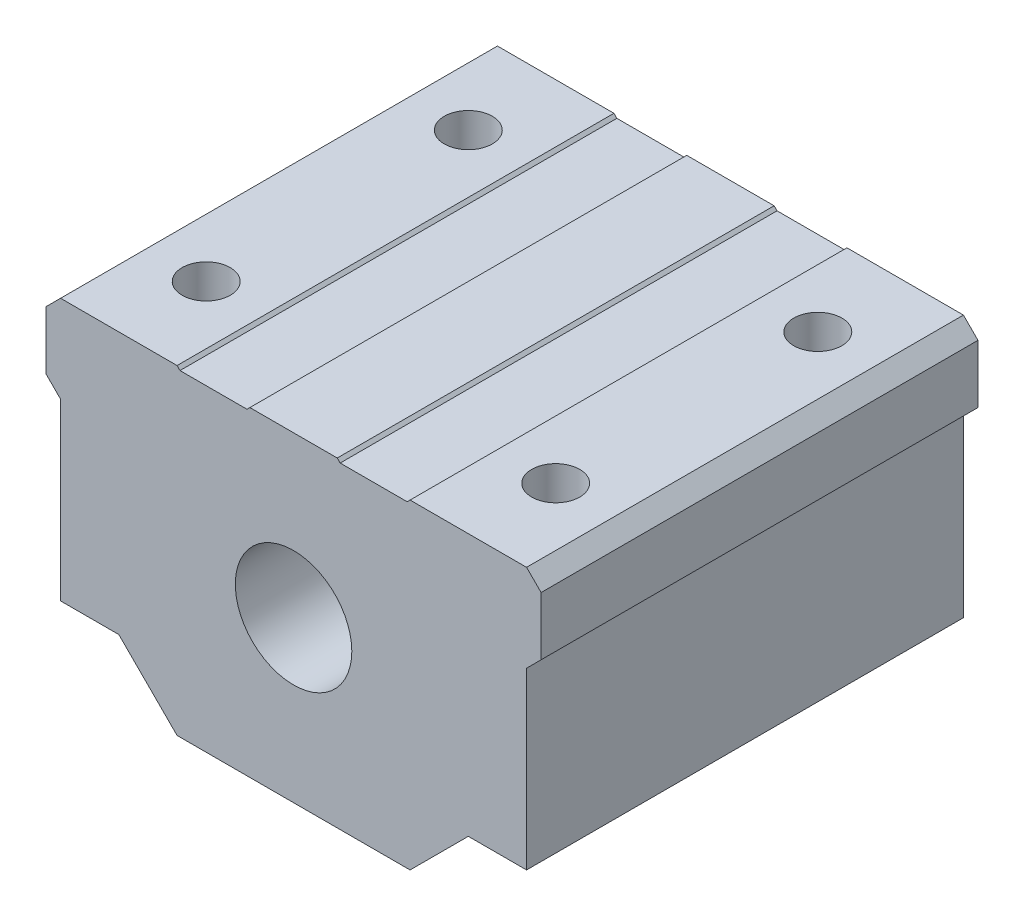
ISO-10303-21;
HEADER;
FILE_DESCRIPTION(('STEP AP214'),'2;1');
FILE_NAME('part.step','',(''),(''),'','','');
FILE_SCHEMA(('AUTOMOTIVE_DESIGN { 1 0 10303 214 1 1 1 1 }'));
ENDSEC;
DATA;
#1=APPLICATION_CONTEXT('core data for automotive mechanical design processes');
#2=APPLICATION_PROTOCOL_DEFINITION('international standard','automotive_design',2000,#1);
#3=PRODUCT_CONTEXT('',#1,'mechanical');
#4=PRODUCT('Part','Part','',(#3));
#5=PRODUCT_RELATED_PRODUCT_CATEGORY('part','',(#4));
#6=PRODUCT_DEFINITION_FORMATION('','',#4);
#7=PRODUCT_DEFINITION_CONTEXT('part definition',#1,'design');
#8=PRODUCT_DEFINITION('design','',#6,#7);
#9=PRODUCT_DEFINITION_SHAPE('','',#8);
#10=(LENGTH_UNIT() NAMED_UNIT(*) SI_UNIT(.MILLI.,.METRE.));
#11=(NAMED_UNIT(*) PLANE_ANGLE_UNIT() SI_UNIT($,.RADIAN.));
#12=(NAMED_UNIT(*) SI_UNIT($,.STERADIAN.) SOLID_ANGLE_UNIT());
#13=UNCERTAINTY_MEASURE_WITH_UNIT(LENGTH_MEASURE(1.E-05),#10,'distance_accuracy_value','');
#14=(GEOMETRIC_REPRESENTATION_CONTEXT(3) GLOBAL_UNCERTAINTY_ASSIGNED_CONTEXT((#13)) GLOBAL_UNIT_ASSIGNED_CONTEXT((#10,
#11,#12)) REPRESENTATION_CONTEXT('',''));
#15=CARTESIAN_POINT('',(0.,0.,0.));
#16=DIRECTION('',(0.,0.,1.));
#17=DIRECTION('',(1.,0.,0.));
#18=AXIS2_PLACEMENT_3D('',#15,#16,#17);
#19=CARTESIAN_POINT('',(-17.,22.,30.));
#20=DIRECTION('',(0.,-1.,0.));
#21=DIRECTION('',(0.,0.,-1.));
#22=AXIS2_PLACEMENT_3D('',#19,#20,#21);
#23=PLANE('',#22);
#24=DIRECTION('',(-1.,0.,0.));
#25=VECTOR('',#24,1.);
#26=CARTESIAN_POINT('',(-17.,22.,0.));
#27=LINE('',#26,#25);
#28=CARTESIAN_POINT('',(3.,22.,0.));
#29=VERTEX_POINT('',#28);
#30=CARTESIAN_POINT('',(-3.,22.,0.));
#31=VERTEX_POINT('',#30);
#32=EDGE_CURVE('E365',#29,#31,#27,.T.);
#33=ORIENTED_EDGE('',*,*,#32,.T.);
#34=DIRECTION('',(0.,0.,-1.));
#35=VECTOR('',#34,1.);
#36=CARTESIAN_POINT('',(-3.,22.,30.));
#37=LINE('',#36,#35);
#38=CARTESIAN_POINT('',(-3.,22.,30.));
#39=VERTEX_POINT('',#38);
#40=EDGE_CURVE('E240',#39,#31,#37,.T.);
#41=ORIENTED_EDGE('',*,*,#40,.F.);
#42=DIRECTION('',(-1.,0.,0.));
#43=VECTOR('',#42,1.);
#44=CARTESIAN_POINT('',(-17.,22.,30.));
#45=LINE('',#44,#43);
#46=CARTESIAN_POINT('',(3.,22.,30.));
#47=VERTEX_POINT('',#46);
#48=EDGE_CURVE('E337',#47,#39,#45,.T.);
#49=ORIENTED_EDGE('',*,*,#48,.F.);
#50=DIRECTION('',(0.,0.,-1.));
#51=VECTOR('',#50,1.);
#52=CARTESIAN_POINT('',(3.,22.,30.));
#53=LINE('',#52,#51);
#54=EDGE_CURVE('E262',#47,#29,#53,.T.);
#55=ORIENTED_EDGE('',*,*,#54,.T.);
#56=EDGE_LOOP('',(#33,#41,#49,#55));
#57=FACE_BOUND('',#56,.T.);
#58=ADVANCED_FACE('F34',(#57),#23,.F.);
#59=CARTESIAN_POINT('',(12.,22.,24.));
#60=DIRECTION('',(0.,1.,0.));
#61=DIRECTION('',(0.,0.,1.));
#62=AXIS2_PLACEMENT_3D('',#59,#60,#61);
#63=CIRCLE('',#62,1.64999999999999);
#64=CARTESIAN_POINT('',(12.,22.,25.65));
#65=VERTEX_POINT('',#64);
#66=EDGE_CURVE('E285',#65,#65,#63,.T.);
#67=ORIENTED_EDGE('',*,*,#66,.F.);
#68=EDGE_LOOP('',(#67));
#69=FACE_BOUND('',#68,.T.);
#70=CARTESIAN_POINT('',(12.,22.,6.));
#71=DIRECTION('',(0.,1.,0.));
#72=DIRECTION('',(0.,0.,1.));
#73=AXIS2_PLACEMENT_3D('',#70,#71,#72);
#74=CIRCLE('',#73,1.64999999999999);
#75=CARTESIAN_POINT('',(12.,22.,7.64999999999999));
#76=VERTEX_POINT('',#75);
#77=EDGE_CURVE('E271',#76,#76,#74,.T.);
#78=ORIENTED_EDGE('',*,*,#77,.F.);
#79=EDGE_LOOP('',(#78));
#80=FACE_BOUND('',#79,.T.);
#81=CARTESIAN_POINT('',(16.,22.,0.));
#82=VERTEX_POINT('',#81);
#83=CARTESIAN_POINT('',(8.,22.,0.));
#84=VERTEX_POINT('',#83);
#85=EDGE_CURVE('E361',#82,#84,#27,.T.);
#86=ORIENTED_EDGE('',*,*,#85,.T.);
#87=DIRECTION('',(0.,0.,-1.));
#88=VECTOR('',#87,1.);
#89=CARTESIAN_POINT('',(8.,22.,30.));
#90=LINE('',#89,#88);
#91=CARTESIAN_POINT('',(8.,22.,30.));
#92=VERTEX_POINT('',#91);
#93=EDGE_CURVE('E260',#92,#84,#90,.T.);
#94=ORIENTED_EDGE('',*,*,#93,.F.);
#95=CARTESIAN_POINT('',(16.,22.,30.));
#96=VERTEX_POINT('',#95);
#97=EDGE_CURVE('E333',#96,#92,#45,.T.);
#98=ORIENTED_EDGE('',*,*,#97,.F.);
#99=DIRECTION('',(0.,0.,-1.));
#100=VECTOR('',#99,1.);
#101=CARTESIAN_POINT('',(16.,22.,30.));
#102=LINE('',#101,#100);
#103=EDGE_CURVE('E426',#96,#82,#102,.T.);
#104=ORIENTED_EDGE('',*,*,#103,.T.);
#105=EDGE_LOOP('',(#86,#94,#98,#104));
#106=FACE_BOUND('',#105,.T.);
#107=ADVANCED_FACE('F460',(#69,#80,#106),#23,.F.);
#108=CARTESIAN_POINT('',(-8.,0.,30.));
#109=DIRECTION('',(0.707106781186549,0.707106781186546,0.));
#110=DIRECTION('',(-0.707106781186546,0.707106781186549,0.));
#111=AXIS2_PLACEMENT_3D('',#108,#109,#110);
#112=PLANE('',#111);
#113=DIRECTION('',(0.,0.,-1.));
#114=VECTOR('',#113,1.);
#115=CARTESIAN_POINT('',(-12.,3.99999999999999,30.));
#116=LINE('',#115,#114);
#117=CARTESIAN_POINT('',(-12.,3.99999999999999,30.));
#118=VERTEX_POINT('',#117);
#119=CARTESIAN_POINT('',(-12.,3.99999999999999,25.5));
#120=VERTEX_POINT('',#119);
#121=EDGE_CURVE('E372',#118,#120,#116,.T.);
#122=ORIENTED_EDGE('',*,*,#121,.T.);
#123=CARTESIAN_POINT('',(-12.,4.00000000000001,24.));
#124=DIRECTION('',(0.707106781186549,0.707106781186546,0.));
#125=DIRECTION('',(-0.707106781186546,0.707106781186549,0.));
#126=AXIS2_PLACEMENT_3D('',#123,#124,#125);
#127=ELLIPSE('',#126,2.12132034355965,1.5);
#128=CARTESIAN_POINT('',(-12.,3.99999999999999,22.5));
#129=VERTEX_POINT('',#128);
#130=EDGE_CURVE('E295',#120,#129,#127,.T.);
#131=ORIENTED_EDGE('',*,*,#130,.T.);
#132=CARTESIAN_POINT('',(-12.,3.99999999999999,7.5));
#133=VERTEX_POINT('',#132);
#134=EDGE_CURVE('E376',#129,#133,#116,.T.);
#135=ORIENTED_EDGE('',*,*,#134,.T.);
#136=CARTESIAN_POINT('',(-12.,4.00000000000001,6.));
#137=DIRECTION('',(0.707106781186549,0.707106781186546,0.));
#138=DIRECTION('',(-0.707106781186546,0.707106781186549,0.));
#139=AXIS2_PLACEMENT_3D('',#136,#137,#138);
#140=ELLIPSE('',#139,2.12132034355965,1.5);
#141=CARTESIAN_POINT('',(-12.,3.99999999999999,4.5));
#142=VERTEX_POINT('',#141);
#143=EDGE_CURVE('E292',#133,#142,#140,.T.);
#144=ORIENTED_EDGE('',*,*,#143,.T.);
#145=CARTESIAN_POINT('',(-12.,3.99999999999999,0.));
#146=VERTEX_POINT('',#145);
#147=EDGE_CURVE('E344',#142,#146,#116,.T.);
#148=ORIENTED_EDGE('',*,*,#147,.T.);
#149=DIRECTION('',(0.707106781186546,-0.707106781186549,0.));
#150=VECTOR('',#149,1.);
#151=CARTESIAN_POINT('',(-8.,0.,0.));
#152=LINE('',#151,#150);
#153=CARTESIAN_POINT('',(-8.,0.,0.));
#154=VERTEX_POINT('',#153);
#155=EDGE_CURVE('E314',#146,#154,#152,.T.);
#156=ORIENTED_EDGE('',*,*,#155,.T.);
#157=DIRECTION('',(0.,0.,-1.));
#158=VECTOR('',#157,1.);
#159=CARTESIAN_POINT('',(-8.,0.,30.));
#160=LINE('',#159,#158);
#161=CARTESIAN_POINT('',(-8.,0.,30.));
#162=VERTEX_POINT('',#161);
#163=EDGE_CURVE('E396',#162,#154,#160,.T.);
#164=ORIENTED_EDGE('',*,*,#163,.F.);
#165=DIRECTION('',(0.707106781186546,-0.707106781186549,0.));
#166=VECTOR('',#165,1.);
#167=CARTESIAN_POINT('',(-8.,0.,30.));
#168=LINE('',#167,#166);
#169=EDGE_CURVE('E317',#118,#162,#168,.T.);
#170=ORIENTED_EDGE('',*,*,#169,.F.);
#171=EDGE_LOOP('',(#122,#131,#135,#144,#148,#156,#164,#170));
#172=FACE_BOUND('',#171,.T.);
#173=ADVANCED_FACE('F467',(#172),#112,.F.);
#174=CARTESIAN_POINT('',(8.,0.,30.));
#175=DIRECTION('',(0.,1.,0.));
#176=DIRECTION('',(0.,0.,1.));
#177=AXIS2_PLACEMENT_3D('',#174,#175,#176);
#178=PLANE('',#177);
#179=DIRECTION('',(1.,0.,0.));
#180=VECTOR('',#179,1.);
#181=CARTESIAN_POINT('',(8.,0.,0.));
#182=LINE('',#181,#180);
#183=CARTESIAN_POINT('',(8.,0.,0.));
#184=VERTEX_POINT('',#183);
#185=EDGE_CURVE('E347',#154,#184,#182,.T.);
#186=ORIENTED_EDGE('',*,*,#185,.T.);
#187=DIRECTION('',(0.,0.,-1.));
#188=VECTOR('',#187,1.);
#189=CARTESIAN_POINT('',(8.,0.,30.));
#190=LINE('',#189,#188);
#191=CARTESIAN_POINT('',(8.,0.,30.));
#192=VERTEX_POINT('',#191);
#193=EDGE_CURVE('E392',#192,#184,#190,.T.);
#194=ORIENTED_EDGE('',*,*,#193,.F.);
#195=DIRECTION('',(1.,0.,0.));
#196=VECTOR('',#195,1.);
#197=CARTESIAN_POINT('',(8.,0.,30.));
#198=LINE('',#197,#196);
#199=EDGE_CURVE('E320',#162,#192,#198,.T.);
#200=ORIENTED_EDGE('',*,*,#199,.F.);
#201=ORIENTED_EDGE('',*,*,#163,.T.);
#202=EDGE_LOOP('',(#186,#194,#200,#201));
#203=FACE_BOUND('',#202,.T.);
#204=ADVANCED_FACE('F528',(#203),#178,.F.);
#205=CARTESIAN_POINT('',(8.,0.,30.));
#206=DIRECTION('',(-0.707106781186549,0.707106781186546,0.));
#207=DIRECTION('',(-0.707106781186546,-0.707106781186549,0.));
#208=AXIS2_PLACEMENT_3D('',#205,#206,#207);
#209=PLANE('',#208);
#210=DIRECTION('',(0.,0.,-1.));
#211=VECTOR('',#210,1.);
#212=CARTESIAN_POINT('',(12.,3.99999999999999,30.));
#213=LINE('',#212,#211);
#214=CARTESIAN_POINT('',(12.,3.99999999999999,4.5));
#215=VERTEX_POINT('',#214);
#216=CARTESIAN_POINT('',(12.,3.99999999999999,0.));
#217=VERTEX_POINT('',#216);
#218=EDGE_CURVE('E388',#215,#217,#213,.T.);
#219=ORIENTED_EDGE('',*,*,#218,.F.);
#220=CARTESIAN_POINT('',(12.,4.00000000000001,6.));
#221=DIRECTION('',(-0.707106781186549,0.707106781186546,0.));
#222=DIRECTION('',(0.707106781186546,0.707106781186549,0.));
#223=AXIS2_PLACEMENT_3D('',#220,#221,#222);
#224=ELLIPSE('',#223,2.12132034355965,1.5);
#225=CARTESIAN_POINT('',(12.,3.99999999999999,7.5));
#226=VERTEX_POINT('',#225);
#227=EDGE_CURVE('E307',#215,#226,#224,.T.);
#228=ORIENTED_EDGE('',*,*,#227,.T.);
#229=CARTESIAN_POINT('',(12.,3.99999999999999,22.5));
#230=VERTEX_POINT('',#229);
#231=EDGE_CURVE('E393',#230,#226,#213,.T.);
#232=ORIENTED_EDGE('',*,*,#231,.F.);
#233=CARTESIAN_POINT('',(12.,4.00000000000001,24.));
#234=DIRECTION('',(-0.707106781186549,0.707106781186546,0.));
#235=DIRECTION('',(0.707106781186546,0.707106781186549,0.));
#236=AXIS2_PLACEMENT_3D('',#233,#234,#235);
#237=ELLIPSE('',#236,2.12132034355965,1.5);
#238=CARTESIAN_POINT('',(12.,3.99999999999999,25.5));
#239=VERTEX_POINT('',#238);
#240=EDGE_CURVE('E301',#230,#239,#237,.T.);
#241=ORIENTED_EDGE('',*,*,#240,.T.);
#242=CARTESIAN_POINT('',(12.,3.99999999999999,30.));
#243=VERTEX_POINT('',#242);
#244=EDGE_CURVE('E389',#243,#239,#213,.T.);
#245=ORIENTED_EDGE('',*,*,#244,.F.);
#246=DIRECTION('',(0.707106781186546,0.707106781186549,0.));
#247=VECTOR('',#246,1.);
#248=CARTESIAN_POINT('',(8.,0.,30.));
#249=LINE('',#248,#247);
#250=EDGE_CURVE('E323',#192,#243,#249,.T.);
#251=ORIENTED_EDGE('',*,*,#250,.F.);
#252=ORIENTED_EDGE('',*,*,#193,.T.);
#253=DIRECTION('',(0.707106781186546,0.707106781186549,0.));
#254=VECTOR('',#253,1.);
#255=CARTESIAN_POINT('',(8.,0.,0.));
#256=LINE('',#255,#254);
#257=EDGE_CURVE('E349',#184,#217,#256,.T.);
#258=ORIENTED_EDGE('',*,*,#257,.T.);
#259=EDGE_LOOP('',(#219,#228,#232,#241,#245,#251,#252,#258));
#260=FACE_BOUND('',#259,.T.);
#261=ADVANCED_FACE('F534',(#260),#209,.F.);
#262=CARTESIAN_POINT('',(12.,3.99999999999999,30.));
#263=DIRECTION('',(0.,1.,0.));
#264=DIRECTION('',(0.,0.,1.));
#265=AXIS2_PLACEMENT_3D('',#262,#263,#264);
#266=PLANE('',#265);
#267=ORIENTED_EDGE('',*,*,#231,.T.);
#268=CARTESIAN_POINT('',(12.,3.99999999999999,6.));
#269=DIRECTION('',(0.,1.,0.));
#270=DIRECTION('',(0.,0.,1.));
#271=AXIS2_PLACEMENT_3D('',#268,#269,#270);
#272=CIRCLE('',#271,1.5);
#273=EDGE_CURVE('E304',#226,#215,#272,.T.);
#274=ORIENTED_EDGE('',*,*,#273,.T.);
#275=ORIENTED_EDGE('',*,*,#218,.T.);
#276=DIRECTION('',(1.,0.,0.));
#277=VECTOR('',#276,1.);
#278=CARTESIAN_POINT('',(12.,3.99999999999999,0.));
#279=LINE('',#278,#277);
#280=CARTESIAN_POINT('',(16.,3.99999999999999,0.));
#281=VERTEX_POINT('',#280);
#282=EDGE_CURVE('E352',#217,#281,#279,.T.);
#283=ORIENTED_EDGE('',*,*,#282,.T.);
#284=DIRECTION('',(0.,0.,-1.));
#285=VECTOR('',#284,1.);
#286=CARTESIAN_POINT('',(16.,3.99999999999999,30.));
#287=LINE('',#286,#285);
#288=CARTESIAN_POINT('',(16.,3.99999999999999,30.));
#289=VERTEX_POINT('',#288);
#290=EDGE_CURVE('E385',#289,#281,#287,.T.);
#291=ORIENTED_EDGE('',*,*,#290,.F.);
#292=DIRECTION('',(1.,0.,0.));
#293=VECTOR('',#292,1.);
#294=CARTESIAN_POINT('',(12.,3.99999999999999,30.));
#295=LINE('',#294,#293);
#296=EDGE_CURVE('E325',#243,#289,#295,.T.);
#297=ORIENTED_EDGE('',*,*,#296,.F.);
#298=ORIENTED_EDGE('',*,*,#244,.T.);
#299=CARTESIAN_POINT('',(12.,3.99999999999999,24.));
#300=DIRECTION('',(0.,1.,0.));
#301=DIRECTION('',(0.,0.,1.));
#302=AXIS2_PLACEMENT_3D('',#299,#300,#301);
#303=CIRCLE('',#302,1.5);
#304=EDGE_CURVE('E298',#239,#230,#303,.T.);
#305=ORIENTED_EDGE('',*,*,#304,.T.);
#306=EDGE_LOOP('',(#267,#274,#275,#283,#291,#297,#298,#305));
#307=FACE_BOUND('',#306,.T.);
#308=ADVANCED_FACE('F541',(#307),#266,.F.);
#309=CARTESIAN_POINT('',(16.,3.99999999999999,30.));
#310=DIRECTION('',(-1.,0.,0.));
#311=DIRECTION('',(0.,0.,1.));
#312=AXIS2_PLACEMENT_3D('',#309,#310,#311);
#313=PLANE('',#312);
#314=DIRECTION('',(0.,1.,0.));
#315=VECTOR('',#314,1.);
#316=CARTESIAN_POINT('',(16.,3.99999999999999,0.));
#317=LINE('',#316,#315);
#318=CARTESIAN_POINT('',(16.,16.,0.));
#319=VERTEX_POINT('',#318);
#320=EDGE_CURVE('E354',#281,#319,#317,.T.);
#321=ORIENTED_EDGE('',*,*,#320,.T.);
#322=DIRECTION('',(0.,0.,-1.));
#323=VECTOR('',#322,1.);
#324=CARTESIAN_POINT('',(16.,16.,30.));
#325=LINE('',#324,#323);
#326=CARTESIAN_POINT('',(16.,16.,30.));
#327=VERTEX_POINT('',#326);
#328=EDGE_CURVE('E382',#327,#319,#325,.T.);
#329=ORIENTED_EDGE('',*,*,#328,.F.);
#330=DIRECTION('',(0.,1.,0.));
#331=VECTOR('',#330,1.);
#332=CARTESIAN_POINT('',(16.,3.99999999999999,30.));
#333=LINE('',#332,#331);
#334=EDGE_CURVE('E327',#289,#327,#333,.T.);
#335=ORIENTED_EDGE('',*,*,#334,.F.);
#336=ORIENTED_EDGE('',*,*,#290,.T.);
#337=EDGE_LOOP('',(#321,#329,#335,#336));
#338=FACE_BOUND('',#337,.T.);
#339=ADVANCED_FACE('F482',(#338),#313,.F.);
#340=CARTESIAN_POINT('',(17.,16.,30.));
#341=DIRECTION('',(-1.,0.,0.));
#342=DIRECTION('',(0.,0.,1.));
#343=AXIS2_PLACEMENT_3D('',#340,#341,#342);
#344=PLANE('',#343);
#345=DIRECTION('',(0.,1.,0.));
#346=VECTOR('',#345,1.);
#347=CARTESIAN_POINT('',(17.,16.,30.));
#348=LINE('',#347,#346);
#349=CARTESIAN_POINT('',(17.,17.,30.));
#350=VERTEX_POINT('',#349);
#351=CARTESIAN_POINT('',(17.,21.,30.));
#352=VERTEX_POINT('',#351);
#353=EDGE_CURVE('E329',#350,#352,#348,.T.);
#354=ORIENTED_EDGE('',*,*,#353,.F.);
#355=DIRECTION('',(0.,0.,-1.));
#356=VECTOR('',#355,1.);
#357=CARTESIAN_POINT('',(17.,17.,30.));
#358=LINE('',#357,#356);
#359=CARTESIAN_POINT('',(17.,17.,0.));
#360=VERTEX_POINT('',#359);
#361=EDGE_CURVE('E423',#350,#360,#358,.T.);
#362=ORIENTED_EDGE('',*,*,#361,.T.);
#363=DIRECTION('',(0.,1.,0.));
#364=VECTOR('',#363,1.);
#365=CARTESIAN_POINT('',(17.,16.,0.));
#366=LINE('',#365,#364);
#367=CARTESIAN_POINT('',(17.,21.,0.));
#368=VERTEX_POINT('',#367);
#369=EDGE_CURVE('E357',#360,#368,#366,.T.);
#370=ORIENTED_EDGE('',*,*,#369,.T.);
#371=DIRECTION('',(0.,0.,1.));
#372=VECTOR('',#371,1.);
#373=CARTESIAN_POINT('',(17.,21.,30.));
#374=LINE('',#373,#372);
#375=EDGE_CURVE('E421',#368,#352,#374,.T.);
#376=ORIENTED_EDGE('',*,*,#375,.T.);
#377=EDGE_LOOP('',(#354,#362,#370,#376));
#378=FACE_BOUND('',#377,.T.);
#379=ADVANCED_FACE('F474',(#378),#344,.F.);
#380=CARTESIAN_POINT('',(-12.,22.,6.));
#381=DIRECTION('',(0.,1.,0.));
#382=DIRECTION('',(0.,0.,1.));
#383=AXIS2_PLACEMENT_3D('',#380,#381,#382);
#384=CIRCLE('',#383,1.64999999999999);
#385=CARTESIAN_POINT('',(-12.,22.,7.64999999999999));
#386=VERTEX_POINT('',#385);
#387=EDGE_CURVE('E239',#386,#386,#384,.T.);
#388=ORIENTED_EDGE('',*,*,#387,.F.);
#389=EDGE_LOOP('',(#388));
#390=FACE_BOUND('',#389,.T.);
#391=CARTESIAN_POINT('',(-12.,22.,24.));
#392=DIRECTION('',(0.,1.,0.));
#393=DIRECTION('',(0.,0.,1.));
#394=AXIS2_PLACEMENT_3D('',#391,#392,#393);
#395=CIRCLE('',#394,1.64999999999999);
#396=CARTESIAN_POINT('',(-12.,22.,25.65));
#397=VERTEX_POINT('',#396);
#398=EDGE_CURVE('E278',#397,#397,#395,.T.);
#399=ORIENTED_EDGE('',*,*,#398,.F.);
#400=EDGE_LOOP('',(#399));
#401=FACE_BOUND('',#400,.T.);
#402=CARTESIAN_POINT('',(-8.,22.,30.));
#403=VERTEX_POINT('',#402);
#404=CARTESIAN_POINT('',(-16.,22.,30.));
#405=VERTEX_POINT('',#404);
#406=EDGE_CURVE('E332',#403,#405,#45,.T.);
#407=ORIENTED_EDGE('',*,*,#406,.F.);
#408=DIRECTION('',(0.,0.,-1.));
#409=VECTOR('',#408,1.);
#410=CARTESIAN_POINT('',(-8.,22.,30.));
#411=LINE('',#410,#409);
#412=CARTESIAN_POINT('',(-8.,22.,0.));
#413=VERTEX_POINT('',#412);
#414=EDGE_CURVE('E214',#403,#413,#411,.T.);
#415=ORIENTED_EDGE('',*,*,#414,.T.);
#416=CARTESIAN_POINT('',(-16.,22.,0.));
#417=VERTEX_POINT('',#416);
#418=EDGE_CURVE('E360',#413,#417,#27,.T.);
#419=ORIENTED_EDGE('',*,*,#418,.T.);
#420=DIRECTION('',(0.,0.,1.));
#421=VECTOR('',#420,1.);
#422=CARTESIAN_POINT('',(-16.,22.,30.));
#423=LINE('',#422,#421);
#424=EDGE_CURVE('E429',#417,#405,#423,.T.);
#425=ORIENTED_EDGE('',*,*,#424,.T.);
#426=EDGE_LOOP('',(#407,#415,#419,#425));
#427=FACE_BOUND('',#426,.T.);
#428=ADVANCED_FACE('F463',(#390,#401,#427),#23,.F.);
#429=CARTESIAN_POINT('',(-17.,16.,30.));
#430=DIRECTION('',(1.,0.,0.));
#431=DIRECTION('',(0.,0.,-1.));
#432=AXIS2_PLACEMENT_3D('',#429,#430,#431);
#433=PLANE('',#432);
#434=DIRECTION('',(0.,-1.,0.));
#435=VECTOR('',#434,1.);
#436=CARTESIAN_POINT('',(-17.,16.,0.));
#437=LINE('',#436,#435);
#438=CARTESIAN_POINT('',(-17.,21.,0.));
#439=VERTEX_POINT('',#438);
#440=CARTESIAN_POINT('',(-17.,17.,0.));
#441=VERTEX_POINT('',#440);
#442=EDGE_CURVE('E364',#439,#441,#437,.T.);
#443=ORIENTED_EDGE('',*,*,#442,.T.);
#444=DIRECTION('',(0.,0.,1.));
#445=VECTOR('',#444,1.);
#446=CARTESIAN_POINT('',(-17.,17.,30.));
#447=LINE('',#446,#445);
#448=CARTESIAN_POINT('',(-17.,17.,30.));
#449=VERTEX_POINT('',#448);
#450=EDGE_CURVE('E411',#441,#449,#447,.T.);
#451=ORIENTED_EDGE('',*,*,#450,.T.);
#452=DIRECTION('',(0.,-1.,0.));
#453=VECTOR('',#452,1.);
#454=CARTESIAN_POINT('',(-17.,16.,30.));
#455=LINE('',#454,#453);
#456=CARTESIAN_POINT('',(-17.,21.,30.));
#457=VERTEX_POINT('',#456);
#458=EDGE_CURVE('E336',#457,#449,#455,.T.);
#459=ORIENTED_EDGE('',*,*,#458,.F.);
#460=DIRECTION('',(0.,0.,-1.));
#461=VECTOR('',#460,1.);
#462=CARTESIAN_POINT('',(-17.,21.,30.));
#463=LINE('',#462,#461);
#464=EDGE_CURVE('E408',#457,#439,#463,.T.);
#465=ORIENTED_EDGE('',*,*,#464,.T.);
#466=EDGE_LOOP('',(#443,#451,#459,#465));
#467=FACE_BOUND('',#466,.T.);
#468=ADVANCED_FACE('F473',(#467),#433,.F.);
#469=CARTESIAN_POINT('',(-16.,3.99999999999999,30.));
#470=DIRECTION('',(1.,0.,0.));
#471=DIRECTION('',(0.,0.,-1.));
#472=AXIS2_PLACEMENT_3D('',#469,#470,#471);
#473=PLANE('',#472);
#474=DIRECTION('',(0.,-1.,0.));
#475=VECTOR('',#474,1.);
#476=CARTESIAN_POINT('',(-16.,3.99999999999999,0.));
#477=LINE('',#476,#475);
#478=CARTESIAN_POINT('',(-16.,16.,0.));
#479=VERTEX_POINT('',#478);
#480=CARTESIAN_POINT('',(-16.,3.99999999999999,0.));
#481=VERTEX_POINT('',#480);
#482=EDGE_CURVE('E368',#479,#481,#477,.T.);
#483=ORIENTED_EDGE('',*,*,#482,.T.);
#484=DIRECTION('',(0.,0.,-1.));
#485=VECTOR('',#484,1.);
#486=CARTESIAN_POINT('',(-16.,3.99999999999999,30.));
#487=LINE('',#486,#485);
#488=CARTESIAN_POINT('',(-16.,3.99999999999999,30.));
#489=VERTEX_POINT('',#488);
#490=EDGE_CURVE('E375',#489,#481,#487,.T.);
#491=ORIENTED_EDGE('',*,*,#490,.F.);
#492=DIRECTION('',(0.,-1.,0.));
#493=VECTOR('',#492,1.);
#494=CARTESIAN_POINT('',(-16.,3.99999999999999,30.));
#495=LINE('',#494,#493);
#496=CARTESIAN_POINT('',(-16.,16.,30.));
#497=VERTEX_POINT('',#496);
#498=EDGE_CURVE('E340',#497,#489,#495,.T.);
#499=ORIENTED_EDGE('',*,*,#498,.F.);
#500=DIRECTION('',(0.,0.,-1.));
#501=VECTOR('',#500,1.);
#502=CARTESIAN_POINT('',(-16.,16.,30.));
#503=LINE('',#502,#501);
#504=EDGE_CURVE('E379',#497,#479,#503,.T.);
#505=ORIENTED_EDGE('',*,*,#504,.T.);
#506=EDGE_LOOP('',(#483,#491,#499,#505));
#507=FACE_BOUND('',#506,.T.);
#508=ADVANCED_FACE('F480',(#507),#473,.F.);
#509=CARTESIAN_POINT('',(-12.,3.99999999999999,30.));
#510=DIRECTION('',(0.,1.,0.));
#511=DIRECTION('',(0.,0.,1.));
#512=AXIS2_PLACEMENT_3D('',#509,#510,#511);
#513=PLANE('',#512);
#514=ORIENTED_EDGE('',*,*,#134,.F.);
#515=CARTESIAN_POINT('',(-12.,3.99999999999999,24.));
#516=DIRECTION('',(0.,1.,0.));
#517=DIRECTION('',(0.,0.,1.));
#518=AXIS2_PLACEMENT_3D('',#515,#516,#517);
#519=CIRCLE('',#518,1.5);
#520=EDGE_CURVE('E11',#129,#120,#519,.T.);
#521=ORIENTED_EDGE('',*,*,#520,.T.);
#522=ORIENTED_EDGE('',*,*,#121,.F.);
#523=DIRECTION('',(1.,0.,0.));
#524=VECTOR('',#523,1.);
#525=CARTESIAN_POINT('',(-12.,3.99999999999999,30.));
#526=LINE('',#525,#524);
#527=EDGE_CURVE('E342',#489,#118,#526,.T.);
#528=ORIENTED_EDGE('',*,*,#527,.F.);
#529=ORIENTED_EDGE('',*,*,#490,.T.);
#530=DIRECTION('',(1.,0.,0.));
#531=VECTOR('',#530,1.);
#532=CARTESIAN_POINT('',(-12.,3.99999999999999,0.));
#533=LINE('',#532,#531);
#534=EDGE_CURVE('E321',#481,#146,#533,.T.);
#535=ORIENTED_EDGE('',*,*,#534,.T.);
#536=ORIENTED_EDGE('',*,*,#147,.F.);
#537=CARTESIAN_POINT('',(-12.,3.99999999999999,6.));
#538=DIRECTION('',(0.,1.,0.));
#539=DIRECTION('',(0.,0.,1.));
#540=AXIS2_PLACEMENT_3D('',#537,#538,#539);
#541=CIRCLE('',#540,1.5);
#542=EDGE_CURVE('E43',#142,#133,#541,.T.);
#543=ORIENTED_EDGE('',*,*,#542,.T.);
#544=EDGE_LOOP('',(#514,#521,#522,#528,#529,#535,#536,#543));
#545=FACE_BOUND('',#544,.T.);
#546=ADVANCED_FACE('F521',(#545),#513,.F.);
#547=CARTESIAN_POINT('',(0.,0.,30.));
#548=DIRECTION('',(0.,0.,-1.));
#549=DIRECTION('',(-1.,0.,0.));
#550=AXIS2_PLACEMENT_3D('',#547,#548,#549);
#551=PLANE('',#550);
#552=CARTESIAN_POINT('',(0.,11.,30.));
#553=DIRECTION('',(0.,0.,1.));
#554=DIRECTION('',(1.,0.,0.));
#555=AXIS2_PLACEMENT_3D('',#552,#553,#554);
#556=CIRCLE('',#555,4.);
#557=CARTESIAN_POINT('',(4.,11.,30.));
#558=VERTEX_POINT('',#557);
#559=EDGE_CURVE('E310',#558,#558,#556,.T.);
#560=ORIENTED_EDGE('',*,*,#559,.F.);
#561=EDGE_LOOP('',(#560));
#562=FACE_BOUND('',#561,.T.);
#563=ORIENTED_EDGE('',*,*,#48,.T.);
#564=DIRECTION('',(-0.707106781186546,-0.707106781186549,0.));
#565=VECTOR('',#564,1.);
#566=CARTESIAN_POINT('',(-12.5,12.4999999999999,30.));
#567=LINE('',#566,#565);
#568=CARTESIAN_POINT('',(-3.2,21.8,30.));
#569=VERTEX_POINT('',#568);
#570=EDGE_CURVE('E215',#39,#569,#567,.T.);
#571=ORIENTED_EDGE('',*,*,#570,.T.);
#572=DIRECTION('',(1.,0.,0.));
#573=VECTOR('',#572,1.);
#574=CARTESIAN_POINT('',(0.,21.8,30.));
#575=LINE('',#574,#573);
#576=CARTESIAN_POINT('',(-7.8,21.8,30.));
#577=VERTEX_POINT('',#576);
#578=EDGE_CURVE('E210',#577,#569,#575,.T.);
#579=ORIENTED_EDGE('',*,*,#578,.F.);
#580=DIRECTION('',(-0.707106781186548,0.707106781186548,0.));
#581=VECTOR('',#580,1.);
#582=CARTESIAN_POINT('',(7.,7.,30.));
#583=LINE('',#582,#581);
#584=EDGE_CURVE('E218',#577,#403,#583,.T.);
#585=ORIENTED_EDGE('',*,*,#584,.T.);
#586=ORIENTED_EDGE('',*,*,#406,.T.);
#587=DIRECTION('',(0.707106781186548,0.707106781186548,0.));
#588=VECTOR('',#587,1.);
#589=CARTESIAN_POINT('',(-17.,21.,30.));
#590=LINE('',#589,#588);
#591=EDGE_CURVE('E415',#405,#457,#590,.F.);
#592=ORIENTED_EDGE('',*,*,#591,.T.);
#593=ORIENTED_EDGE('',*,*,#458,.T.);
#594=DIRECTION('',(-0.707106781186548,0.707106781186548,0.));
#595=VECTOR('',#594,1.);
#596=CARTESIAN_POINT('',(-16.,16.,30.));
#597=LINE('',#596,#595);
#598=EDGE_CURVE('E419',#449,#497,#597,.F.);
#599=ORIENTED_EDGE('',*,*,#598,.T.);
#600=ORIENTED_EDGE('',*,*,#498,.T.);
#601=ORIENTED_EDGE('',*,*,#527,.T.);
#602=ORIENTED_EDGE('',*,*,#169,.T.);
#603=ORIENTED_EDGE('',*,*,#199,.T.);
#604=ORIENTED_EDGE('',*,*,#250,.T.);
#605=ORIENTED_EDGE('',*,*,#296,.T.);
#606=ORIENTED_EDGE('',*,*,#334,.T.);
#607=DIRECTION('',(-0.707106781186548,-0.707106781186548,0.));
#608=VECTOR('',#607,1.);
#609=CARTESIAN_POINT('',(17.,17.,30.));
#610=LINE('',#609,#608);
#611=EDGE_CURVE('E417',#327,#350,#610,.F.);
#612=ORIENTED_EDGE('',*,*,#611,.T.);
#613=ORIENTED_EDGE('',*,*,#353,.T.);
#614=DIRECTION('',(0.707106781186548,-0.707106781186548,0.));
#615=VECTOR('',#614,1.);
#616=CARTESIAN_POINT('',(16.,22.,30.));
#617=LINE('',#616,#615);
#618=EDGE_CURVE('E413',#352,#96,#617,.F.);
#619=ORIENTED_EDGE('',*,*,#618,.T.);
#620=ORIENTED_EDGE('',*,*,#97,.T.);
#621=DIRECTION('',(-0.707106781186548,-0.707106781186548,0.));
#622=VECTOR('',#621,1.);
#623=CARTESIAN_POINT('',(-6.99999999999999,6.99999999999999,30.));
#624=LINE('',#623,#622);
#625=CARTESIAN_POINT('',(7.8,21.8,30.));
#626=VERTEX_POINT('',#625);
#627=EDGE_CURVE('E250',#92,#626,#624,.T.);
#628=ORIENTED_EDGE('',*,*,#627,.T.);
#629=DIRECTION('',(-1.,0.,0.));
#630=VECTOR('',#629,1.);
#631=CARTESIAN_POINT('',(0.,21.8,30.));
#632=LINE('',#631,#630);
#633=CARTESIAN_POINT('',(3.2,21.8,30.));
#634=VERTEX_POINT('',#633);
#635=EDGE_CURVE('E243',#626,#634,#632,.T.);
#636=ORIENTED_EDGE('',*,*,#635,.T.);
#637=DIRECTION('',(-0.707106781186546,0.707106781186549,0.));
#638=VECTOR('',#637,1.);
#639=CARTESIAN_POINT('',(12.5,12.4999999999999,30.));
#640=LINE('',#639,#638);
#641=EDGE_CURVE('E246',#634,#47,#640,.T.);
#642=ORIENTED_EDGE('',*,*,#641,.T.);
#643=EDGE_LOOP('',(#563,#571,#579,#585,#586,#592,#593,#599,#600,#601,#602,#603,#604,#605,#606,
#612,#613,#619,#620,#628,#636,#642));
#644=FACE_BOUND('',#643,.T.);
#645=ADVANCED_FACE('F226',(#562,#644),#551,.F.);
#646=CARTESIAN_POINT('',(0.,0.,0.));
#647=DIRECTION('',(0.,0.,-1.));
#648=DIRECTION('',(-1.,0.,0.));
#649=AXIS2_PLACEMENT_3D('',#646,#647,#648);
#650=PLANE('',#649);
#651=DIRECTION('',(-0.707106781186546,-0.707106781186549,0.));
#652=VECTOR('',#651,1.);
#653=CARTESIAN_POINT('',(-12.5,12.4999999999999,0.));
#654=LINE('',#653,#652);
#655=CARTESIAN_POINT('',(-3.2,21.8,0.));
#656=VERTEX_POINT('',#655);
#657=EDGE_CURVE('E227',#31,#656,#654,.T.);
#658=ORIENTED_EDGE('',*,*,#657,.F.);
#659=ORIENTED_EDGE('',*,*,#32,.F.);
#660=DIRECTION('',(-0.707106781186546,0.707106781186549,0.));
#661=VECTOR('',#660,1.);
#662=CARTESIAN_POINT('',(12.5,12.4999999999999,0.));
#663=LINE('',#662,#661);
#664=CARTESIAN_POINT('',(3.2,21.8,0.));
#665=VERTEX_POINT('',#664);
#666=EDGE_CURVE('E255',#665,#29,#663,.T.);
#667=ORIENTED_EDGE('',*,*,#666,.F.);
#668=DIRECTION('',(-1.,0.,0.));
#669=VECTOR('',#668,1.);
#670=CARTESIAN_POINT('',(0.,21.8,0.));
#671=LINE('',#670,#669);
#672=CARTESIAN_POINT('',(7.8,21.8,0.));
#673=VERTEX_POINT('',#672);
#674=EDGE_CURVE('E59',#673,#665,#671,.T.);
#675=ORIENTED_EDGE('',*,*,#674,.F.);
#676=DIRECTION('',(-0.707106781186548,-0.707106781186548,0.));
#677=VECTOR('',#676,1.);
#678=CARTESIAN_POINT('',(-6.99999999999999,6.99999999999999,0.));
#679=LINE('',#678,#677);
#680=EDGE_CURVE('E247',#84,#673,#679,.T.);
#681=ORIENTED_EDGE('',*,*,#680,.F.);
#682=ORIENTED_EDGE('',*,*,#85,.F.);
#683=DIRECTION('',(-0.707106781186548,0.707106781186548,0.));
#684=VECTOR('',#683,1.);
#685=CARTESIAN_POINT('',(19.,19.,0.));
#686=LINE('',#685,#684);
#687=EDGE_CURVE('E399',#82,#368,#686,.F.);
#688=ORIENTED_EDGE('',*,*,#687,.T.);
#689=ORIENTED_EDGE('',*,*,#369,.F.);
#690=DIRECTION('',(0.707106781186548,0.707106781186548,0.));
#691=VECTOR('',#690,1.);
#692=CARTESIAN_POINT('',(0.,0.,0.));
#693=LINE('',#692,#691);
#694=EDGE_CURVE('E404',#360,#319,#693,.F.);
#695=ORIENTED_EDGE('',*,*,#694,.T.);
#696=ORIENTED_EDGE('',*,*,#320,.F.);
#697=ORIENTED_EDGE('',*,*,#282,.F.);
#698=ORIENTED_EDGE('',*,*,#257,.F.);
#699=ORIENTED_EDGE('',*,*,#185,.F.);
#700=ORIENTED_EDGE('',*,*,#155,.F.);
#701=ORIENTED_EDGE('',*,*,#534,.F.);
#702=ORIENTED_EDGE('',*,*,#482,.F.);
#703=DIRECTION('',(0.707106781186548,-0.707106781186548,0.));
#704=VECTOR('',#703,1.);
#705=CARTESIAN_POINT('',(0.,0.,0.));
#706=LINE('',#705,#704);
#707=EDGE_CURVE('E406',#479,#441,#706,.F.);
#708=ORIENTED_EDGE('',*,*,#707,.T.);
#709=ORIENTED_EDGE('',*,*,#442,.F.);
#710=DIRECTION('',(-0.707106781186548,-0.707106781186548,0.));
#711=VECTOR('',#710,1.);
#712=CARTESIAN_POINT('',(-19.,19.,0.));
#713=LINE('',#712,#711);
#714=EDGE_CURVE('E401',#439,#417,#713,.F.);
#715=ORIENTED_EDGE('',*,*,#714,.T.);
#716=ORIENTED_EDGE('',*,*,#418,.F.);
#717=DIRECTION('',(-0.707106781186548,0.707106781186548,0.));
#718=VECTOR('',#717,1.);
#719=CARTESIAN_POINT('',(7.,7.,0.));
#720=LINE('',#719,#718);
#721=CARTESIAN_POINT('',(-7.8,21.8,0.));
#722=VERTEX_POINT('',#721);
#723=EDGE_CURVE('E230',#722,#413,#720,.T.);
#724=ORIENTED_EDGE('',*,*,#723,.F.);
#725=DIRECTION('',(1.,0.,0.));
#726=VECTOR('',#725,1.);
#727=CARTESIAN_POINT('',(0.,21.8,0.));
#728=LINE('',#727,#726);
#729=EDGE_CURVE('E51',#722,#656,#728,.T.);
#730=ORIENTED_EDGE('',*,*,#729,.T.);
#731=EDGE_LOOP('',(#658,#659,#667,#675,#681,#682,#688,#689,#695,#696,#697,#698,#699,#700,#701,
#702,#708,#709,#715,#716,#724,#730));
#732=FACE_BOUND('',#731,.T.);
#733=CARTESIAN_POINT('',(0.,11.,0.));
#734=DIRECTION('',(0.,0.,1.));
#735=DIRECTION('',(1.,0.,0.));
#736=AXIS2_PLACEMENT_3D('',#733,#734,#735);
#737=CIRCLE('',#736,4.);
#738=CARTESIAN_POINT('',(4.,11.,0.));
#739=VERTEX_POINT('',#738);
#740=EDGE_CURVE('E311',#739,#739,#737,.T.);
#741=ORIENTED_EDGE('',*,*,#740,.T.);
#742=EDGE_LOOP('',(#741));
#743=FACE_BOUND('',#742,.T.);
#744=ADVANCED_FACE('F499',(#732,#743),#650,.T.);
#745=CARTESIAN_POINT('',(0.,11.,0.));
#746=DIRECTION('',(0.,0.,1.));
#747=DIRECTION('',(1.,0.,0.));
#748=AXIS2_PLACEMENT_3D('',#745,#746,#747);
#749=CYLINDRICAL_SURFACE('',#748,4.);
#750=ORIENTED_EDGE('',*,*,#740,.F.);
#751=EDGE_LOOP('',(#750));
#752=FACE_BOUND('',#751,.T.);
#753=ORIENTED_EDGE('',*,*,#559,.T.);
#754=EDGE_LOOP('',(#753));
#755=FACE_BOUND('',#754,.T.);
#756=ADVANCED_FACE('F611',(#752,#755),#749,.F.);
#757=CARTESIAN_POINT('',(-16.,16.,30.));
#758=DIRECTION('',(0.707106781186547,0.707106781186547,0.));
#759=DIRECTION('',(0.,0.,-1.));
#760=AXIS2_PLACEMENT_3D('',#757,#758,#759);
#761=PLANE('',#760);
#762=ORIENTED_EDGE('',*,*,#598,.F.);
#763=ORIENTED_EDGE('',*,*,#450,.F.);
#764=ORIENTED_EDGE('',*,*,#707,.F.);
#765=ORIENTED_EDGE('',*,*,#504,.F.);
#766=EDGE_LOOP('',(#762,#763,#764,#765));
#767=FACE_BOUND('',#766,.T.);
#768=ADVANCED_FACE('F510',(#767),#761,.F.);
#769=CARTESIAN_POINT('',(17.,17.,30.));
#770=DIRECTION('',(-0.707106781186547,0.707106781186547,0.));
#771=DIRECTION('',(0.,0.,-1.));
#772=AXIS2_PLACEMENT_3D('',#769,#770,#771);
#773=PLANE('',#772);
#774=ORIENTED_EDGE('',*,*,#611,.F.);
#775=ORIENTED_EDGE('',*,*,#328,.T.);
#776=ORIENTED_EDGE('',*,*,#694,.F.);
#777=ORIENTED_EDGE('',*,*,#361,.F.);
#778=EDGE_LOOP('',(#774,#775,#776,#777));
#779=FACE_BOUND('',#778,.T.);
#780=ADVANCED_FACE('F548',(#779),#773,.F.);
#781=CARTESIAN_POINT('',(-17.,21.,30.));
#782=DIRECTION('',(0.707106781186547,-0.707106781186547,0.));
#783=DIRECTION('',(0.,0.,-1.));
#784=AXIS2_PLACEMENT_3D('',#781,#782,#783);
#785=PLANE('',#784);
#786=ORIENTED_EDGE('',*,*,#591,.F.);
#787=ORIENTED_EDGE('',*,*,#424,.F.);
#788=ORIENTED_EDGE('',*,*,#714,.F.);
#789=ORIENTED_EDGE('',*,*,#464,.F.);
#790=EDGE_LOOP('',(#786,#787,#788,#789));
#791=FACE_BOUND('',#790,.T.);
#792=ADVANCED_FACE('F505',(#791),#785,.F.);
#793=CARTESIAN_POINT('',(16.,22.,30.));
#794=DIRECTION('',(-0.707106781186547,-0.707106781186547,0.));
#795=DIRECTION('',(0.,0.,-1.));
#796=AXIS2_PLACEMENT_3D('',#793,#794,#795);
#797=PLANE('',#796);
#798=ORIENTED_EDGE('',*,*,#618,.F.);
#799=ORIENTED_EDGE('',*,*,#375,.F.);
#800=ORIENTED_EDGE('',*,*,#687,.F.);
#801=ORIENTED_EDGE('',*,*,#103,.F.);
#802=EDGE_LOOP('',(#798,#799,#800,#801));
#803=FACE_BOUND('',#802,.T.);
#804=ADVANCED_FACE('F36',(#803),#797,.F.);
#805=CARTESIAN_POINT('',(-12.,0.,6.));
#806=DIRECTION('',(0.,1.,0.));
#807=DIRECTION('',(0.,0.,1.));
#808=AXIS2_PLACEMENT_3D('',#805,#806,#807);
#809=CYLINDRICAL_SURFACE('',#808,1.5);
#810=CARTESIAN_POINT('',(-12.,13.9098709071459,6.));
#811=DIRECTION('',(0.,1.,0.));
#812=DIRECTION('',(0.,0.,1.));
#813=AXIS2_PLACEMENT_3D('',#810,#811,#812);
#814=CIRCLE('',#813,1.5);
#815=CARTESIAN_POINT('',(-12.,13.9098709071459,7.5));
#816=VERTEX_POINT('',#815);
#817=EDGE_CURVE('E38',#816,#816,#814,.T.);
#818=ORIENTED_EDGE('',*,*,#817,.T.);
#819=EDGE_LOOP('',(#818));
#820=FACE_BOUND('',#819,.T.);
#821=ORIENTED_EDGE('',*,*,#542,.F.);
#822=ORIENTED_EDGE('',*,*,#143,.F.);
#823=EDGE_LOOP('',(#821,#822));
#824=FACE_BOUND('',#823,.T.);
#825=ADVANCED_FACE('F587',(#820,#824),#809,.F.);
#826=CARTESIAN_POINT('',(-12.,0.,24.));
#827=DIRECTION('',(0.,1.,0.));
#828=DIRECTION('',(0.,0.,1.));
#829=AXIS2_PLACEMENT_3D('',#826,#827,#828);
#830=CYLINDRICAL_SURFACE('',#829,1.5);
#831=CARTESIAN_POINT('',(-12.,13.9098709071459,24.));
#832=DIRECTION('',(0.,1.,0.));
#833=DIRECTION('',(0.,0.,1.));
#834=AXIS2_PLACEMENT_3D('',#831,#832,#833);
#835=CIRCLE('',#834,1.5);
#836=CARTESIAN_POINT('',(-12.,13.9098709071459,25.5));
#837=VERTEX_POINT('',#836);
#838=EDGE_CURVE('E284',#837,#837,#835,.T.);
#839=ORIENTED_EDGE('',*,*,#838,.T.);
#840=EDGE_LOOP('',(#839));
#841=FACE_BOUND('',#840,.T.);
#842=ORIENTED_EDGE('',*,*,#520,.F.);
#843=ORIENTED_EDGE('',*,*,#130,.F.);
#844=EDGE_LOOP('',(#842,#843));
#845=FACE_BOUND('',#844,.T.);
#846=ADVANCED_FACE('F590',(#841,#845),#830,.F.);
#847=CARTESIAN_POINT('',(12.,0.,24.));
#848=DIRECTION('',(0.,1.,0.));
#849=DIRECTION('',(0.,0.,1.));
#850=AXIS2_PLACEMENT_3D('',#847,#848,#849);
#851=CYLINDRICAL_SURFACE('',#850,1.5);
#852=CARTESIAN_POINT('',(12.,13.9098709071459,24.));
#853=DIRECTION('',(0.,1.,0.));
#854=DIRECTION('',(0.,0.,1.));
#855=AXIS2_PLACEMENT_3D('',#852,#853,#854);
#856=CIRCLE('',#855,1.5);
#857=CARTESIAN_POINT('',(12.,13.9098709071459,25.5));
#858=VERTEX_POINT('',#857);
#859=EDGE_CURVE('E291',#858,#858,#856,.T.);
#860=ORIENTED_EDGE('',*,*,#859,.T.);
#861=EDGE_LOOP('',(#860));
#862=FACE_BOUND('',#861,.T.);
#863=ORIENTED_EDGE('',*,*,#304,.F.);
#864=ORIENTED_EDGE('',*,*,#240,.F.);
#865=EDGE_LOOP('',(#863,#864));
#866=FACE_BOUND('',#865,.T.);
#867=ADVANCED_FACE('F596',(#862,#866),#851,.F.);
#868=CARTESIAN_POINT('',(12.,0.,6.));
#869=DIRECTION('',(0.,1.,0.));
#870=DIRECTION('',(0.,0.,1.));
#871=AXIS2_PLACEMENT_3D('',#868,#869,#870);
#872=CYLINDRICAL_SURFACE('',#871,1.5);
#873=CARTESIAN_POINT('',(12.,13.9098709071459,6.));
#874=DIRECTION('',(0.,1.,0.));
#875=DIRECTION('',(0.,0.,1.));
#876=AXIS2_PLACEMENT_3D('',#873,#874,#875);
#877=CIRCLE('',#876,1.5);
#878=CARTESIAN_POINT('',(12.,13.9098709071459,7.5));
#879=VERTEX_POINT('',#878);
#880=EDGE_CURVE('E277',#879,#879,#877,.T.);
#881=ORIENTED_EDGE('',*,*,#880,.T.);
#882=EDGE_LOOP('',(#881));
#883=FACE_BOUND('',#882,.T.);
#884=ORIENTED_EDGE('',*,*,#273,.F.);
#885=ORIENTED_EDGE('',*,*,#227,.F.);
#886=EDGE_LOOP('',(#884,#885));
#887=FACE_BOUND('',#886,.T.);
#888=ADVANCED_FACE('F440',(#883,#887),#872,.F.);
#889=CARTESIAN_POINT('',(12.,14.,24.));
#890=DIRECTION('',(0.,1.,0.));
#891=DIRECTION('',(0.,0.,1.));
#892=AXIS2_PLACEMENT_3D('',#889,#890,#891);
#893=CONICAL_SURFACE('',#892,1.65,1.02974425867665);
#894=CARTESIAN_POINT('',(12.,14.,24.));
#895=DIRECTION('',(0.,1.,0.));
#896=DIRECTION('',(0.,0.,1.));
#897=AXIS2_PLACEMENT_3D('',#894,#895,#896);
#898=CIRCLE('',#897,1.65);
#899=CARTESIAN_POINT('',(12.,14.,25.65));
#900=VERTEX_POINT('',#899);
#901=EDGE_CURVE('E288',#900,#900,#898,.T.);
#902=ORIENTED_EDGE('',*,*,#901,.T.);
#903=EDGE_LOOP('',(#902));
#904=FACE_BOUND('',#903,.T.);
#905=ORIENTED_EDGE('',*,*,#859,.F.);
#906=EDGE_LOOP('',(#905));
#907=FACE_BOUND('',#906,.T.);
#908=ADVANCED_FACE('F604',(#904,#907),#893,.F.);
#909=CARTESIAN_POINT('',(12.,22.,24.));
#910=DIRECTION('',(0.,1.,0.));
#911=DIRECTION('',(0.,0.,1.));
#912=AXIS2_PLACEMENT_3D('',#909,#910,#911);
#913=CYLINDRICAL_SURFACE('',#912,1.64999999999999);
#914=ORIENTED_EDGE('',*,*,#901,.F.);
#915=EDGE_LOOP('',(#914));
#916=FACE_BOUND('',#915,.T.);
#917=ORIENTED_EDGE('',*,*,#66,.T.);
#918=EDGE_LOOP('',(#917));
#919=FACE_BOUND('',#918,.T.);
#920=ADVANCED_FACE('F696',(#916,#919),#913,.F.);
#921=CARTESIAN_POINT('',(-12.,14.,24.));
#922=DIRECTION('',(0.,1.,0.));
#923=DIRECTION('',(0.,0.,1.));
#924=AXIS2_PLACEMENT_3D('',#921,#922,#923);
#925=CONICAL_SURFACE('',#924,1.65,1.02974425867665);
#926=CARTESIAN_POINT('',(-12.,14.,24.));
#927=DIRECTION('',(0.,1.,0.));
#928=DIRECTION('',(0.,0.,1.));
#929=AXIS2_PLACEMENT_3D('',#926,#927,#928);
#930=CIRCLE('',#929,1.65);
#931=CARTESIAN_POINT('',(-12.,14.,25.65));
#932=VERTEX_POINT('',#931);
#933=EDGE_CURVE('E281',#932,#932,#930,.T.);
#934=ORIENTED_EDGE('',*,*,#933,.T.);
#935=EDGE_LOOP('',(#934));
#936=FACE_BOUND('',#935,.T.);
#937=ORIENTED_EDGE('',*,*,#838,.F.);
#938=EDGE_LOOP('',(#937));
#939=FACE_BOUND('',#938,.T.);
#940=ADVANCED_FACE('F456',(#936,#939),#925,.F.);
#941=CARTESIAN_POINT('',(-12.,22.,24.));
#942=DIRECTION('',(0.,1.,0.));
#943=DIRECTION('',(0.,0.,1.));
#944=AXIS2_PLACEMENT_3D('',#941,#942,#943);
#945=CYLINDRICAL_SURFACE('',#944,1.64999999999999);
#946=ORIENTED_EDGE('',*,*,#933,.F.);
#947=EDGE_LOOP('',(#946));
#948=FACE_BOUND('',#947,.T.);
#949=ORIENTED_EDGE('',*,*,#398,.T.);
#950=EDGE_LOOP('',(#949));
#951=FACE_BOUND('',#950,.T.);
#952=ADVANCED_FACE('F446',(#948,#951),#945,.F.);
#953=CARTESIAN_POINT('',(12.,14.,6.));
#954=DIRECTION('',(0.,1.,0.));
#955=DIRECTION('',(0.,0.,1.));
#956=AXIS2_PLACEMENT_3D('',#953,#954,#955);
#957=CONICAL_SURFACE('',#956,1.65,1.02974425867665);
#958=CARTESIAN_POINT('',(12.,14.,6.));
#959=DIRECTION('',(0.,1.,0.));
#960=DIRECTION('',(0.,0.,1.));
#961=AXIS2_PLACEMENT_3D('',#958,#959,#960);
#962=CIRCLE('',#961,1.65);
#963=CARTESIAN_POINT('',(12.,14.,7.64999999999999));
#964=VERTEX_POINT('',#963);
#965=EDGE_CURVE('E274',#964,#964,#962,.T.);
#966=ORIENTED_EDGE('',*,*,#965,.T.);
#967=EDGE_LOOP('',(#966));
#968=FACE_BOUND('',#967,.T.);
#969=ORIENTED_EDGE('',*,*,#880,.F.);
#970=EDGE_LOOP('',(#969));
#971=FACE_BOUND('',#970,.T.);
#972=ADVANCED_FACE('F443',(#968,#971),#957,.F.);
#973=CARTESIAN_POINT('',(12.,22.,6.));
#974=DIRECTION('',(0.,1.,0.));
#975=DIRECTION('',(0.,0.,1.));
#976=AXIS2_PLACEMENT_3D('',#973,#974,#975);
#977=CYLINDRICAL_SURFACE('',#976,1.64999999999999);
#978=ORIENTED_EDGE('',*,*,#965,.F.);
#979=EDGE_LOOP('',(#978));
#980=FACE_BOUND('',#979,.T.);
#981=ORIENTED_EDGE('',*,*,#77,.T.);
#982=EDGE_LOOP('',(#981));
#983=FACE_BOUND('',#982,.T.);
#984=ADVANCED_FACE('F445',(#980,#983),#977,.F.);
#985=CARTESIAN_POINT('',(-12.,14.,6.));
#986=DIRECTION('',(0.,1.,0.));
#987=DIRECTION('',(0.,0.,1.));
#988=AXIS2_PLACEMENT_3D('',#985,#986,#987);
#989=CONICAL_SURFACE('',#988,1.65,1.02974425867665);
#990=CARTESIAN_POINT('',(-12.,14.,6.));
#991=DIRECTION('',(0.,1.,0.));
#992=DIRECTION('',(0.,0.,1.));
#993=AXIS2_PLACEMENT_3D('',#990,#991,#992);
#994=CIRCLE('',#993,1.65);
#995=CARTESIAN_POINT('',(-12.,14.,7.64999999999999));
#996=VERTEX_POINT('',#995);
#997=EDGE_CURVE('E268',#996,#996,#994,.T.);
#998=ORIENTED_EDGE('',*,*,#997,.T.);
#999=EDGE_LOOP('',(#998));
#1000=FACE_BOUND('',#999,.T.);
#1001=ORIENTED_EDGE('',*,*,#817,.F.);
#1002=EDGE_LOOP('',(#1001));
#1003=FACE_BOUND('',#1002,.T.);
#1004=ADVANCED_FACE('F453',(#1000,#1003),#989,.F.);
#1005=CARTESIAN_POINT('',(-12.,22.,6.));
#1006=DIRECTION('',(0.,1.,0.));
#1007=DIRECTION('',(0.,0.,1.));
#1008=AXIS2_PLACEMENT_3D('',#1005,#1006,#1007);
#1009=CYLINDRICAL_SURFACE('',#1008,1.64999999999999);
#1010=ORIENTED_EDGE('',*,*,#997,.F.);
#1011=EDGE_LOOP('',(#1010));
#1012=FACE_BOUND('',#1011,.T.);
#1013=ORIENTED_EDGE('',*,*,#387,.T.);
#1014=EDGE_LOOP('',(#1013));
#1015=FACE_BOUND('',#1014,.T.);
#1016=ADVANCED_FACE('F567',(#1012,#1015),#1009,.F.);
#1017=CARTESIAN_POINT('',(0.,21.8,30.));
#1018=DIRECTION('',(0.,-1.,0.));
#1019=DIRECTION('',(0.,0.,-1.));
#1020=AXIS2_PLACEMENT_3D('',#1017,#1018,#1019);
#1021=PLANE('',#1020);
#1022=ORIENTED_EDGE('',*,*,#674,.T.);
#1023=DIRECTION('',(0.,0.,-1.));
#1024=VECTOR('',#1023,1.);
#1025=CARTESIAN_POINT('',(3.2,21.8,30.));
#1026=LINE('',#1025,#1024);
#1027=EDGE_CURVE('E253',#634,#665,#1026,.T.);
#1028=ORIENTED_EDGE('',*,*,#1027,.F.);
#1029=ORIENTED_EDGE('',*,*,#635,.F.);
#1030=DIRECTION('',(0.,0.,-1.));
#1031=VECTOR('',#1030,1.);
#1032=CARTESIAN_POINT('',(7.8,21.8,30.));
#1033=LINE('',#1032,#1031);
#1034=EDGE_CURVE('E235',#626,#673,#1033,.T.);
#1035=ORIENTED_EDGE('',*,*,#1034,.T.);
#1036=EDGE_LOOP('',(#1022,#1028,#1029,#1035));
#1037=FACE_BOUND('',#1036,.T.);
#1038=ADVANCED_FACE('F565',(#1037),#1021,.F.);
#1039=CARTESIAN_POINT('',(-6.99999999999999,6.99999999999999,30.));
#1040=DIRECTION('',(0.707106781186547,-0.707106781186547,0.));
#1041=DIRECTION('',(0.707106781186548,0.707106781186548,0.));
#1042=AXIS2_PLACEMENT_3D('',#1039,#1040,#1041);
#1043=PLANE('',#1042);
#1044=ORIENTED_EDGE('',*,*,#680,.T.);
#1045=ORIENTED_EDGE('',*,*,#1034,.F.);
#1046=ORIENTED_EDGE('',*,*,#627,.F.);
#1047=ORIENTED_EDGE('',*,*,#93,.T.);
#1048=EDGE_LOOP('',(#1044,#1045,#1046,#1047));
#1049=FACE_BOUND('',#1048,.T.);
#1050=ADVANCED_FACE('F561',(#1049),#1043,.F.);
#1051=CARTESIAN_POINT('',(12.5,12.4999999999999,30.));
#1052=DIRECTION('',(-0.707106781186549,-0.707106781186546,0.));
#1053=DIRECTION('',(0.707106781186546,-0.707106781186549,0.));
#1054=AXIS2_PLACEMENT_3D('',#1051,#1052,#1053);
#1055=PLANE('',#1054);
#1056=ORIENTED_EDGE('',*,*,#666,.T.);
#1057=ORIENTED_EDGE('',*,*,#54,.F.);
#1058=ORIENTED_EDGE('',*,*,#641,.F.);
#1059=ORIENTED_EDGE('',*,*,#1027,.T.);
#1060=EDGE_LOOP('',(#1056,#1057,#1058,#1059));
#1061=FACE_BOUND('',#1060,.T.);
#1062=ADVANCED_FACE('F563',(#1061),#1055,.F.);
#1063=CARTESIAN_POINT('',(0.,21.8,30.));
#1064=DIRECTION('',(0.,1.,0.));
#1065=DIRECTION('',(0.,0.,1.));
#1066=AXIS2_PLACEMENT_3D('',#1063,#1064,#1065);
#1067=PLANE('',#1066);
#1068=ORIENTED_EDGE('',*,*,#729,.F.);
#1069=DIRECTION('',(0.,0.,-1.));
#1070=VECTOR('',#1069,1.);
#1071=CARTESIAN_POINT('',(-7.8,21.8,30.));
#1072=LINE('',#1071,#1070);
#1073=EDGE_CURVE('E206',#577,#722,#1072,.T.);
#1074=ORIENTED_EDGE('',*,*,#1073,.F.);
#1075=ORIENTED_EDGE('',*,*,#578,.T.);
#1076=DIRECTION('',(0.,0.,-1.));
#1077=VECTOR('',#1076,1.);
#1078=CARTESIAN_POINT('',(-3.2,21.8,30.));
#1079=LINE('',#1078,#1077);
#1080=EDGE_CURVE('E237',#569,#656,#1079,.T.);
#1081=ORIENTED_EDGE('',*,*,#1080,.T.);
#1082=EDGE_LOOP('',(#1068,#1074,#1075,#1081));
#1083=FACE_BOUND('',#1082,.T.);
#1084=ADVANCED_FACE('F208',(#1083),#1067,.T.);
#1085=CARTESIAN_POINT('',(-12.5,12.4999999999999,30.));
#1086=DIRECTION('',(0.707106781186549,-0.707106781186546,0.));
#1087=DIRECTION('',(0.707106781186546,0.707106781186549,0.));
#1088=AXIS2_PLACEMENT_3D('',#1085,#1086,#1087);
#1089=PLANE('',#1088);
#1090=ORIENTED_EDGE('',*,*,#657,.T.);
#1091=ORIENTED_EDGE('',*,*,#1080,.F.);
#1092=ORIENTED_EDGE('',*,*,#570,.F.);
#1093=ORIENTED_EDGE('',*,*,#40,.T.);
#1094=EDGE_LOOP('',(#1090,#1091,#1092,#1093));
#1095=FACE_BOUND('',#1094,.T.);
#1096=ADVANCED_FACE('F497',(#1095),#1089,.F.);
#1097=CARTESIAN_POINT('',(7.,7.,30.));
#1098=DIRECTION('',(-0.707106781186547,-0.707106781186547,0.));
#1099=DIRECTION('',(0.707106781186548,-0.707106781186548,0.));
#1100=AXIS2_PLACEMENT_3D('',#1097,#1098,#1099);
#1101=PLANE('',#1100);
#1102=ORIENTED_EDGE('',*,*,#723,.T.);
#1103=ORIENTED_EDGE('',*,*,#414,.F.);
#1104=ORIENTED_EDGE('',*,*,#584,.F.);
#1105=ORIENTED_EDGE('',*,*,#1073,.T.);
#1106=EDGE_LOOP('',(#1102,#1103,#1104,#1105));
#1107=FACE_BOUND('',#1106,.T.);
#1108=ADVANCED_FACE('F219',(#1107),#1101,.F.);
#1109=CLOSED_SHELL('',(#58,#107,#173,#204,#261,#308,#339,#379,#428,#468,#508,#546,#645,#744,
#756,#768,#780,#792,#804,#825,#846,#867,#888,#908,#920,#940,#952,#972,#984,#1004,#1016,#1038,
#1050,#1062,#1084,#1096,#1108));
#1110=MANIFOLD_SOLID_BREP('B2',#1109);
#1111=ADVANCED_BREP_SHAPE_REPRESENTATION('',(#18,#1110),#14);
#1112=SHAPE_DEFINITION_REPRESENTATION(#9,#1111);
ENDSEC;
END-ISO-10303-21;
